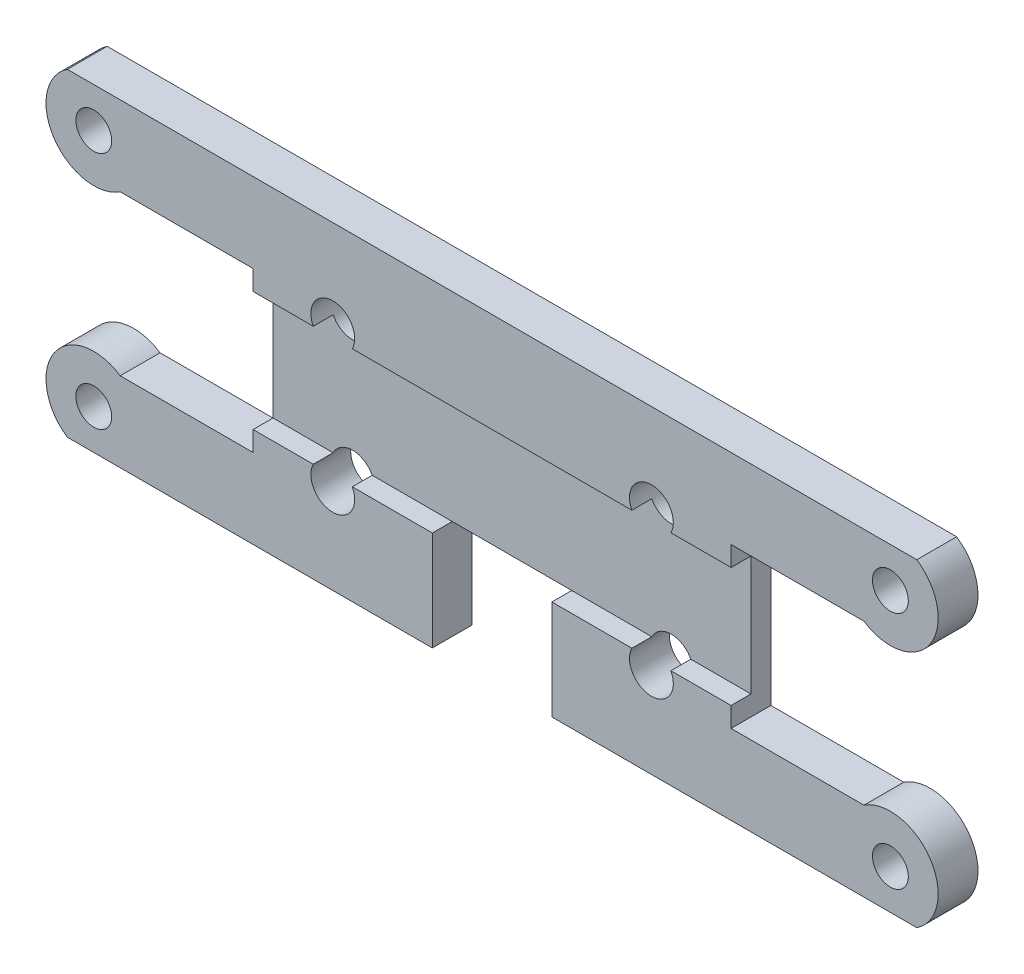
ISO-10303-21;
HEADER;
FILE_DESCRIPTION(('STEP AP214'),'2;1');
FILE_NAME('part.step','',(''),(''),'','','');
FILE_SCHEMA(('AUTOMOTIVE_DESIGN { 1 0 10303 214 1 1 1 1 }'));
ENDSEC;
DATA;
#1=APPLICATION_CONTEXT('core data for automotive mechanical design processes');
#2=APPLICATION_PROTOCOL_DEFINITION('international standard','automotive_design',2000,#1);
#3=PRODUCT_CONTEXT('',#1,'mechanical');
#4=PRODUCT('Part','Part','',(#3));
#5=PRODUCT_RELATED_PRODUCT_CATEGORY('part','',(#4));
#6=PRODUCT_DEFINITION_FORMATION('','',#4);
#7=PRODUCT_DEFINITION_CONTEXT('part definition',#1,'design');
#8=PRODUCT_DEFINITION('design','',#6,#7);
#9=PRODUCT_DEFINITION_SHAPE('','',#8);
#10=(LENGTH_UNIT() NAMED_UNIT(*) SI_UNIT(.MILLI.,.METRE.));
#11=(NAMED_UNIT(*) PLANE_ANGLE_UNIT() SI_UNIT($,.RADIAN.));
#12=(NAMED_UNIT(*) SI_UNIT($,.STERADIAN.) SOLID_ANGLE_UNIT());
#13=UNCERTAINTY_MEASURE_WITH_UNIT(LENGTH_MEASURE(1.E-05),#10,'distance_accuracy_value','');
#14=(GEOMETRIC_REPRESENTATION_CONTEXT(3) GLOBAL_UNCERTAINTY_ASSIGNED_CONTEXT((#13)) GLOBAL_UNIT_ASSIGNED_CONTEXT((#10,
#11,#12)) REPRESENTATION_CONTEXT('',''));
#15=CARTESIAN_POINT('',(0.,0.,0.));
#16=DIRECTION('',(0.,0.,1.));
#17=DIRECTION('',(1.,0.,0.));
#18=AXIS2_PLACEMENT_3D('',#15,#16,#17);
#19=CARTESIAN_POINT('',(0.,-6.,2.));
#20=DIRECTION('',(0.,0.,1.));
#21=DIRECTION('',(1.,0.,0.));
#22=AXIS2_PLACEMENT_3D('',#19,#20,#21);
#23=PLANE('',#22);
#24=DIRECTION('',(0.,1.,0.));
#25=VECTOR('',#24,1.);
#26=CARTESIAN_POINT('',(23.,-13.,2.));
#27=LINE('',#26,#25);
#28=CARTESIAN_POINT('',(23.,-7.99999999999999,2.));
#29=VERTEX_POINT('',#28);
#30=CARTESIAN_POINT('',(23.,-3.,2.));
#31=VERTEX_POINT('',#30);
#32=EDGE_CURVE('E282',#29,#31,#27,.T.);
#33=ORIENTED_EDGE('',*,*,#32,.F.);
#34=DIRECTION('',(-1.,0.,0.));
#35=VECTOR('',#34,1.);
#36=CARTESIAN_POINT('',(-1.32664991614216,-8.,2.));
#37=LINE('',#36,#35);
#38=CARTESIAN_POINT('',(41.3266499161422,-8.,2.));
#39=VERTEX_POINT('',#38);
#40=EDGE_CURVE('E457',#39,#29,#37,.T.);
#41=ORIENTED_EDGE('',*,*,#40,.F.);
#42=CARTESIAN_POINT('',(40.,-6.,2.));
#43=DIRECTION('',(0.,0.,1.));
#44=DIRECTION('',(-1.,0.,0.));
#45=AXIS2_PLACEMENT_3D('',#42,#43,#44);
#46=CIRCLE('',#45,2.4);
#47=CARTESIAN_POINT('',(38.6733500838578,-4.,2.));
#48=VERTEX_POINT('',#47);
#49=EDGE_CURVE('E318',#39,#48,#46,.T.);
#50=ORIENTED_EDGE('',*,*,#49,.T.);
#51=DIRECTION('',(-1.,0.,0.));
#52=VECTOR('',#51,1.);
#53=CARTESIAN_POINT('',(32.,-4.,2.));
#54=LINE('',#53,#52);
#55=CARTESIAN_POINT('',(32.,-4.,2.));
#56=VERTEX_POINT('',#55);
#57=EDGE_CURVE('E321',#48,#56,#54,.T.);
#58=ORIENTED_EDGE('',*,*,#57,.T.);
#59=DIRECTION('',(0.,1.,0.));
#60=VECTOR('',#59,1.);
#61=CARTESIAN_POINT('',(32.,0.,2.));
#62=LINE('',#61,#60);
#63=CARTESIAN_POINT('',(32.,-3.,2.));
#64=VERTEX_POINT('',#63);
#65=EDGE_CURVE('E324',#56,#64,#62,.T.);
#66=ORIENTED_EDGE('',*,*,#65,.T.);
#67=DIRECTION('',(1.,0.,0.));
#68=VECTOR('',#67,1.);
#69=CARTESIAN_POINT('',(32.,-3.,2.));
#70=LINE('',#69,#68);
#71=CARTESIAN_POINT('',(28.9797958971133,-3.,2.));
#72=VERTEX_POINT('',#71);
#73=EDGE_CURVE('E298',#72,#64,#70,.T.);
#74=ORIENTED_EDGE('',*,*,#73,.F.);
#75=CARTESIAN_POINT('',(28.,-3.5,2.));
#76=DIRECTION('',(0.,0.,1.));
#77=DIRECTION('',(-1.,0.,0.));
#78=AXIS2_PLACEMENT_3D('',#75,#76,#77);
#79=CIRCLE('',#78,1.1);
#80=CARTESIAN_POINT('',(27.0202041028867,-3.,2.));
#81=VERTEX_POINT('',#80);
#82=EDGE_CURVE('E306',#81,#72,#79,.T.);
#83=ORIENTED_EDGE('',*,*,#82,.F.);
#84=DIRECTION('',(-1.,0.,0.));
#85=VECTOR('',#84,1.);
#86=CARTESIAN_POINT('',(8.,-3.,2.));
#87=LINE('',#86,#85);
#88=EDGE_CURVE('E422',#81,#31,#87,.T.);
#89=ORIENTED_EDGE('',*,*,#88,.T.);
#90=EDGE_LOOP('',(#33,#41,#50,#58,#66,#74,#83,#89));
#91=FACE_BOUND('',#90,.T.);
#92=CARTESIAN_POINT('',(40.,-6.,2.));
#93=DIRECTION('',(0.,0.,1.));
#94=DIRECTION('',(-1.,0.,0.));
#95=AXIS2_PLACEMENT_3D('',#92,#93,#94);
#96=CIRCLE('',#95,0.9);
#97=CARTESIAN_POINT('',(39.1,-6.,2.));
#98=VERTEX_POINT('',#97);
#99=EDGE_CURVE('E312',#98,#98,#96,.T.);
#100=ORIENTED_EDGE('',*,*,#99,.F.);
#101=EDGE_LOOP('',(#100));
#102=FACE_BOUND('',#101,.T.);
#103=ADVANCED_FACE('F42',(#91,#102),#23,.T.);
#104=CARTESIAN_POINT('',(-1.32664991614216,-8.,2.));
#105=DIRECTION('',(0.,1.,0.));
#106=DIRECTION('',(1.,0.,0.));
#107=AXIS2_PLACEMENT_3D('',#104,#105,#106);
#108=PLANE('',#107);
#109=ORIENTED_EDGE('',*,*,#40,.T.);
#110=DIRECTION('',(0.,0.,-1.));
#111=VECTOR('',#110,1.);
#112=CARTESIAN_POINT('',(23.,-7.99999999999999,2.));
#113=LINE('',#112,#111);
#114=CARTESIAN_POINT('',(23.,-7.99999999999999,0.));
#115=VERTEX_POINT('',#114);
#116=EDGE_CURVE('E295',#29,#115,#113,.T.);
#117=ORIENTED_EDGE('',*,*,#116,.T.);
#118=DIRECTION('',(-1.,0.,0.));
#119=VECTOR('',#118,1.);
#120=CARTESIAN_POINT('',(-1.32664991614216,-8.,0.));
#121=LINE('',#120,#119);
#122=CARTESIAN_POINT('',(41.3266499161422,-8.,0.));
#123=VERTEX_POINT('',#122);
#124=EDGE_CURVE('E276',#123,#115,#121,.T.);
#125=ORIENTED_EDGE('',*,*,#124,.F.);
#126=DIRECTION('',(0.,0.,-1.));
#127=VECTOR('',#126,1.);
#128=CARTESIAN_POINT('',(41.3266499161422,-8.,2.));
#129=LINE('',#128,#127);
#130=EDGE_CURVE('E327',#39,#123,#129,.T.);
#131=ORIENTED_EDGE('',*,*,#130,.F.);
#132=EDGE_LOOP('',(#109,#117,#125,#131));
#133=FACE_BOUND('',#132,.T.);
#134=ADVANCED_FACE('F618',(#133),#108,.F.);
#135=CARTESIAN_POINT('',(8.,-3.,1.));
#136=DIRECTION('',(0.,-1.,0.));
#137=DIRECTION('',(0.,0.,1.));
#138=AXIS2_PLACEMENT_3D('',#135,#136,#137);
#139=PLANE('',#138);
#140=DIRECTION('',(-1.,0.,0.));
#141=VECTOR('',#140,1.);
#142=CARTESIAN_POINT('',(8.,-3.,1.));
#143=LINE('',#142,#141);
#144=CARTESIAN_POINT('',(27.0202041028867,-3.,1.));
#145=VERTEX_POINT('',#144);
#146=CARTESIAN_POINT('',(23.,-3.,1.));
#147=VERTEX_POINT('',#146);
#148=EDGE_CURVE('E415',#145,#147,#143,.T.);
#149=ORIENTED_EDGE('',*,*,#148,.T.);
#150=DIRECTION('',(0.,0.,1.));
#151=VECTOR('',#150,1.);
#152=CARTESIAN_POINT('',(23.,-2.99999999999999,1.));
#153=LINE('',#152,#151);
#154=EDGE_CURVE('E11',#147,#31,#153,.T.);
#155=ORIENTED_EDGE('',*,*,#154,.T.);
#156=ORIENTED_EDGE('',*,*,#88,.F.);
#157=DIRECTION('',(0.,0.,-1.));
#158=VECTOR('',#157,1.);
#159=CARTESIAN_POINT('',(27.0202041028867,-3.,2.));
#160=LINE('',#159,#158);
#161=EDGE_CURVE('E343',#81,#145,#160,.T.);
#162=ORIENTED_EDGE('',*,*,#161,.T.);
#163=EDGE_LOOP('',(#149,#155,#156,#162));
#164=FACE_BOUND('',#163,.T.);
#165=ADVANCED_FACE('F624',(#164),#139,.F.);
#166=CARTESIAN_POINT('',(0.,6.,2.));
#167=DIRECTION('',(0.,0.,1.));
#168=DIRECTION('',(1.,0.,0.));
#169=AXIS2_PLACEMENT_3D('',#166,#167,#168);
#170=PLANE('',#169);
#171=DIRECTION('',(-1.,0.,0.));
#172=VECTOR('',#171,1.);
#173=CARTESIAN_POINT('',(8.,3.,2.));
#174=LINE('',#173,#172);
#175=CARTESIAN_POINT('',(27.0202041028867,3.,2.));
#176=VERTEX_POINT('',#175);
#177=CARTESIAN_POINT('',(12.9797958971133,3.,2.));
#178=VERTEX_POINT('',#177);
#179=EDGE_CURVE('E497',#176,#178,#174,.T.);
#180=ORIENTED_EDGE('',*,*,#179,.F.);
#181=CARTESIAN_POINT('',(28.,3.5,2.));
#182=DIRECTION('',(0.,0.,-1.));
#183=DIRECTION('',(-1.,0.,0.));
#184=AXIS2_PLACEMENT_3D('',#181,#182,#183);
#185=CIRCLE('',#184,1.1);
#186=CARTESIAN_POINT('',(28.9797958971133,3.,2.));
#187=VERTEX_POINT('',#186);
#188=EDGE_CURVE('E361',#176,#187,#185,.T.);
#189=ORIENTED_EDGE('',*,*,#188,.T.);
#190=DIRECTION('',(1.,0.,0.));
#191=VECTOR('',#190,1.);
#192=CARTESIAN_POINT('',(32.,3.,2.));
#193=LINE('',#192,#191);
#194=CARTESIAN_POINT('',(32.,3.,2.));
#195=VERTEX_POINT('',#194);
#196=EDGE_CURVE('E346',#187,#195,#193,.T.);
#197=ORIENTED_EDGE('',*,*,#196,.T.);
#198=DIRECTION('',(0.,-1.,0.));
#199=VECTOR('',#198,1.);
#200=CARTESIAN_POINT('',(32.,0.,2.));
#201=LINE('',#200,#199);
#202=CARTESIAN_POINT('',(32.,4.,2.));
#203=VERTEX_POINT('',#202);
#204=EDGE_CURVE('E383',#203,#195,#201,.T.);
#205=ORIENTED_EDGE('',*,*,#204,.F.);
#206=DIRECTION('',(-1.,0.,0.));
#207=VECTOR('',#206,1.);
#208=CARTESIAN_POINT('',(32.,4.,2.));
#209=LINE('',#208,#207);
#210=CARTESIAN_POINT('',(38.6733500838578,4.,2.));
#211=VERTEX_POINT('',#210);
#212=EDGE_CURVE('E378',#211,#203,#209,.T.);
#213=ORIENTED_EDGE('',*,*,#212,.F.);
#214=CARTESIAN_POINT('',(40.,6.,2.));
#215=DIRECTION('',(0.,0.,-1.));
#216=DIRECTION('',(-1.,0.,0.));
#217=AXIS2_PLACEMENT_3D('',#214,#215,#216);
#218=CIRCLE('',#217,2.4);
#219=CARTESIAN_POINT('',(41.3266499161422,8.,2.));
#220=VERTEX_POINT('',#219);
#221=EDGE_CURVE('E374',#220,#211,#218,.T.);
#222=ORIENTED_EDGE('',*,*,#221,.F.);
#223=DIRECTION('',(-1.,0.,0.));
#224=VECTOR('',#223,1.);
#225=CARTESIAN_POINT('',(-1.32664991614216,8.,2.));
#226=LINE('',#225,#224);
#227=CARTESIAN_POINT('',(-1.32664991614216,8.,2.));
#228=VERTEX_POINT('',#227);
#229=EDGE_CURVE('E525',#220,#228,#226,.T.);
#230=ORIENTED_EDGE('',*,*,#229,.T.);
#231=CARTESIAN_POINT('',(0.,6.,2.));
#232=DIRECTION('',(0.,0.,1.));
#233=DIRECTION('',(1.,0.,0.));
#234=AXIS2_PLACEMENT_3D('',#231,#232,#233);
#235=CIRCLE('',#234,2.4);
#236=CARTESIAN_POINT('',(1.32664991614216,4.,2.));
#237=VERTEX_POINT('',#236);
#238=EDGE_CURVE('E516',#228,#237,#235,.T.);
#239=ORIENTED_EDGE('',*,*,#238,.T.);
#240=DIRECTION('',(1.,0.,0.));
#241=VECTOR('',#240,1.);
#242=CARTESIAN_POINT('',(8.,4.,2.));
#243=LINE('',#242,#241);
#244=CARTESIAN_POINT('',(8.,4.,2.));
#245=VERTEX_POINT('',#244);
#246=EDGE_CURVE('E519',#237,#245,#243,.T.);
#247=ORIENTED_EDGE('',*,*,#246,.T.);
#248=DIRECTION('',(0.,-1.,0.));
#249=VECTOR('',#248,1.);
#250=CARTESIAN_POINT('',(8.,0.,2.));
#251=LINE('',#250,#249);
#252=CARTESIAN_POINT('',(8.,3.,2.));
#253=VERTEX_POINT('',#252);
#254=EDGE_CURVE('E522',#245,#253,#251,.T.);
#255=ORIENTED_EDGE('',*,*,#254,.T.);
#256=CARTESIAN_POINT('',(11.0202041028867,3.,2.));
#257=VERTEX_POINT('',#256);
#258=EDGE_CURVE('E492',#257,#253,#174,.T.);
#259=ORIENTED_EDGE('',*,*,#258,.F.);
#260=CARTESIAN_POINT('',(12.,3.5,2.));
#261=DIRECTION('',(0.,0.,1.));
#262=DIRECTION('',(1.,0.,0.));
#263=AXIS2_PLACEMENT_3D('',#260,#261,#262);
#264=CIRCLE('',#263,1.1);
#265=EDGE_CURVE('E504',#178,#257,#264,.T.);
#266=ORIENTED_EDGE('',*,*,#265,.F.);
#267=EDGE_LOOP('',(#180,#189,#197,#205,#213,#222,#230,#239,#247,#255,#259,#266));
#268=FACE_BOUND('',#267,.T.);
#269=CARTESIAN_POINT('',(0.,6.,2.));
#270=DIRECTION('',(0.,0.,1.));
#271=DIRECTION('',(1.,0.,0.));
#272=AXIS2_PLACEMENT_3D('',#269,#270,#271);
#273=CIRCLE('',#272,0.9);
#274=CARTESIAN_POINT('',(0.9,6.,2.));
#275=VERTEX_POINT('',#274);
#276=EDGE_CURVE('E510',#275,#275,#273,.T.);
#277=ORIENTED_EDGE('',*,*,#276,.F.);
#278=EDGE_LOOP('',(#277));
#279=FACE_BOUND('',#278,.T.);
#280=CARTESIAN_POINT('',(40.,6.,2.));
#281=DIRECTION('',(0.,0.,-1.));
#282=DIRECTION('',(-1.,0.,0.));
#283=AXIS2_PLACEMENT_3D('',#280,#281,#282);
#284=CIRCLE('',#283,0.9);
#285=CARTESIAN_POINT('',(39.1,6.,2.));
#286=VERTEX_POINT('',#285);
#287=EDGE_CURVE('E367',#286,#286,#284,.T.);
#288=ORIENTED_EDGE('',*,*,#287,.T.);
#289=EDGE_LOOP('',(#288));
#290=FACE_BOUND('',#289,.T.);
#291=ADVANCED_FACE('F591',(#268,#279,#290),#170,.T.);
#292=CARTESIAN_POINT('',(0.,6.,0.));
#293=DIRECTION('',(0.,0.,1.));
#294=DIRECTION('',(1.,0.,0.));
#295=AXIS2_PLACEMENT_3D('',#292,#293,#294);
#296=PLANE('',#295);
#297=ORIENTED_EDGE('',*,*,#124,.T.);
#298=DIRECTION('',(0.,1.,0.));
#299=VECTOR('',#298,1.);
#300=CARTESIAN_POINT('',(23.,-13.,0.));
#301=LINE('',#300,#299);
#302=CARTESIAN_POINT('',(23.,-3.,0.));
#303=VERTEX_POINT('',#302);
#304=EDGE_CURVE('E258',#115,#303,#301,.T.);
#305=ORIENTED_EDGE('',*,*,#304,.T.);
#306=DIRECTION('',(-1.,0.,0.));
#307=VECTOR('',#306,1.);
#308=CARTESIAN_POINT('',(17.,-3.,0.));
#309=LINE('',#308,#307);
#310=CARTESIAN_POINT('',(17.,-3.,0.));
#311=VERTEX_POINT('',#310);
#312=EDGE_CURVE('E266',#303,#311,#309,.T.);
#313=ORIENTED_EDGE('',*,*,#312,.T.);
#314=DIRECTION('',(0.,-1.,0.));
#315=VECTOR('',#314,1.);
#316=CARTESIAN_POINT('',(17.,-13.,0.));
#317=LINE('',#316,#315);
#318=CARTESIAN_POINT('',(17.,-7.99999999999999,0.));
#319=VERTEX_POINT('',#318);
#320=EDGE_CURVE('E263',#311,#319,#317,.T.);
#321=ORIENTED_EDGE('',*,*,#320,.T.);
#322=CARTESIAN_POINT('',(-1.32664991614216,-8.,0.));
#323=VERTEX_POINT('',#322);
#324=EDGE_CURVE('E469',#319,#323,#121,.T.);
#325=ORIENTED_EDGE('',*,*,#324,.T.);
#326=CARTESIAN_POINT('',(0.,-6.,0.));
#327=DIRECTION('',(0.,0.,-1.));
#328=DIRECTION('',(1.,0.,0.));
#329=AXIS2_PLACEMENT_3D('',#326,#327,#328);
#330=CIRCLE('',#329,2.4);
#331=CARTESIAN_POINT('',(1.32664991614216,-4.,0.));
#332=VERTEX_POINT('',#331);
#333=EDGE_CURVE('E441',#323,#332,#330,.T.);
#334=ORIENTED_EDGE('',*,*,#333,.T.);
#335=DIRECTION('',(1.,0.,0.));
#336=VECTOR('',#335,1.);
#337=CARTESIAN_POINT('',(8.,-4.,0.));
#338=LINE('',#337,#336);
#339=CARTESIAN_POINT('',(8.,-4.,0.));
#340=VERTEX_POINT('',#339);
#341=EDGE_CURVE('E465',#332,#340,#338,.T.);
#342=ORIENTED_EDGE('',*,*,#341,.T.);
#343=DIRECTION('',(0.,-1.,0.));
#344=VECTOR('',#343,1.);
#345=CARTESIAN_POINT('',(8.,0.,0.));
#346=LINE('',#345,#344);
#347=CARTESIAN_POINT('',(8.,4.,0.));
#348=VERTEX_POINT('',#347);
#349=EDGE_CURVE('E532',#348,#340,#346,.T.);
#350=ORIENTED_EDGE('',*,*,#349,.F.);
#351=DIRECTION('',(1.,0.,0.));
#352=VECTOR('',#351,1.);
#353=CARTESIAN_POINT('',(8.,4.,0.));
#354=LINE('',#353,#352);
#355=CARTESIAN_POINT('',(1.32664991614216,4.,0.));
#356=VERTEX_POINT('',#355);
#357=EDGE_CURVE('E530',#356,#348,#354,.T.);
#358=ORIENTED_EDGE('',*,*,#357,.F.);
#359=CARTESIAN_POINT('',(0.,6.,0.));
#360=DIRECTION('',(0.,0.,1.));
#361=DIRECTION('',(1.,0.,0.));
#362=AXIS2_PLACEMENT_3D('',#359,#360,#361);
#363=CIRCLE('',#362,2.4);
#364=CARTESIAN_POINT('',(-1.32664991614216,8.,0.));
#365=VERTEX_POINT('',#364);
#366=EDGE_CURVE('E513',#365,#356,#363,.T.);
#367=ORIENTED_EDGE('',*,*,#366,.F.);
#368=DIRECTION('',(-1.,0.,0.));
#369=VECTOR('',#368,1.);
#370=CARTESIAN_POINT('',(-1.32664991614216,8.,0.));
#371=LINE('',#370,#369);
#372=CARTESIAN_POINT('',(41.3266499161422,8.,0.));
#373=VERTEX_POINT('',#372);
#374=EDGE_CURVE('E520',#373,#365,#371,.T.);
#375=ORIENTED_EDGE('',*,*,#374,.F.);
#376=CARTESIAN_POINT('',(40.,6.,0.));
#377=DIRECTION('',(0.,0.,-1.));
#378=DIRECTION('',(-1.,0.,0.));
#379=AXIS2_PLACEMENT_3D('',#376,#377,#378);
#380=CIRCLE('',#379,2.4);
#381=CARTESIAN_POINT('',(38.6733500838578,4.,0.));
#382=VERTEX_POINT('',#381);
#383=EDGE_CURVE('E371',#373,#382,#380,.T.);
#384=ORIENTED_EDGE('',*,*,#383,.T.);
#385=DIRECTION('',(-1.,0.,0.));
#386=VECTOR('',#385,1.);
#387=CARTESIAN_POINT('',(32.,4.,0.));
#388=LINE('',#387,#386);
#389=CARTESIAN_POINT('',(32.,4.,0.));
#390=VERTEX_POINT('',#389);
#391=EDGE_CURVE('E391',#382,#390,#388,.T.);
#392=ORIENTED_EDGE('',*,*,#391,.T.);
#393=DIRECTION('',(0.,-1.,0.));
#394=VECTOR('',#393,1.);
#395=CARTESIAN_POINT('',(32.,0.,0.));
#396=LINE('',#395,#394);
#397=CARTESIAN_POINT('',(32.,-4.,0.));
#398=VERTEX_POINT('',#397);
#399=EDGE_CURVE('E379',#390,#398,#396,.T.);
#400=ORIENTED_EDGE('',*,*,#399,.T.);
#401=DIRECTION('',(-1.,0.,0.));
#402=VECTOR('',#401,1.);
#403=CARTESIAN_POINT('',(32.,-4.,0.));
#404=LINE('',#403,#402);
#405=CARTESIAN_POINT('',(38.6733500838578,-4.,0.));
#406=VERTEX_POINT('',#405);
#407=EDGE_CURVE('E322',#406,#398,#404,.T.);
#408=ORIENTED_EDGE('',*,*,#407,.F.);
#409=CARTESIAN_POINT('',(40.,-6.,0.));
#410=DIRECTION('',(0.,0.,1.));
#411=DIRECTION('',(-1.,0.,0.));
#412=AXIS2_PLACEMENT_3D('',#409,#410,#411);
#413=CIRCLE('',#412,2.4);
#414=EDGE_CURVE('E315',#123,#406,#413,.T.);
#415=ORIENTED_EDGE('',*,*,#414,.F.);
#416=EDGE_LOOP('',(#297,#305,#313,#321,#325,#334,#342,#350,#358,#367,#375,#384,#392,#400,#408,#415));
#417=FACE_BOUND('',#416,.T.);
#418=CARTESIAN_POINT('',(0.,6.,0.));
#419=DIRECTION('',(0.,0.,1.));
#420=DIRECTION('',(1.,0.,0.));
#421=AXIS2_PLACEMENT_3D('',#418,#419,#420);
#422=CIRCLE('',#421,0.9);
#423=CARTESIAN_POINT('',(0.9,6.,0.));
#424=VERTEX_POINT('',#423);
#425=EDGE_CURVE('E507',#424,#424,#422,.T.);
#426=ORIENTED_EDGE('',*,*,#425,.T.);
#427=EDGE_LOOP('',(#426));
#428=FACE_BOUND('',#427,.T.);
#429=CARTESIAN_POINT('',(12.,3.5,0.));
#430=DIRECTION('',(0.,0.,1.));
#431=DIRECTION('',(1.,0.,0.));
#432=AXIS2_PLACEMENT_3D('',#429,#430,#431);
#433=CIRCLE('',#432,1.1);
#434=CARTESIAN_POINT('',(13.1,3.5,0.));
#435=VERTEX_POINT('',#434);
#436=EDGE_CURVE('E503',#435,#435,#433,.T.);
#437=ORIENTED_EDGE('',*,*,#436,.T.);
#438=EDGE_LOOP('',(#437));
#439=FACE_BOUND('',#438,.T.);
#440=CARTESIAN_POINT('',(0.,-6.,0.));
#441=DIRECTION('',(0.,0.,-1.));
#442=DIRECTION('',(1.,0.,0.));
#443=AXIS2_PLACEMENT_3D('',#440,#441,#442);
#444=CIRCLE('',#443,0.9);
#445=CARTESIAN_POINT('',(0.900000000000001,-6.,0.));
#446=VERTEX_POINT('',#445);
#447=EDGE_CURVE('E433',#446,#446,#444,.T.);
#448=ORIENTED_EDGE('',*,*,#447,.F.);
#449=EDGE_LOOP('',(#448));
#450=FACE_BOUND('',#449,.T.);
#451=CARTESIAN_POINT('',(12.,-3.5,0.));
#452=DIRECTION('',(0.,0.,-1.));
#453=DIRECTION('',(1.,0.,0.));
#454=AXIS2_PLACEMENT_3D('',#451,#452,#453);
#455=CIRCLE('',#454,1.1);
#456=CARTESIAN_POINT('',(13.1,-3.5,0.));
#457=VERTEX_POINT('',#456);
#458=EDGE_CURVE('E428',#457,#457,#455,.T.);
#459=ORIENTED_EDGE('',*,*,#458,.F.);
#460=EDGE_LOOP('',(#459));
#461=FACE_BOUND('',#460,.T.);
#462=CARTESIAN_POINT('',(40.,6.,0.));
#463=DIRECTION('',(0.,0.,-1.));
#464=DIRECTION('',(-1.,0.,0.));
#465=AXIS2_PLACEMENT_3D('',#462,#463,#464);
#466=CIRCLE('',#465,0.9);
#467=CARTESIAN_POINT('',(39.1,6.,0.));
#468=VERTEX_POINT('',#467);
#469=EDGE_CURVE('E364',#468,#468,#466,.T.);
#470=ORIENTED_EDGE('',*,*,#469,.F.);
#471=EDGE_LOOP('',(#470));
#472=FACE_BOUND('',#471,.T.);
#473=CARTESIAN_POINT('',(28.,3.5,0.));
#474=DIRECTION('',(0.,0.,-1.));
#475=DIRECTION('',(-1.,0.,0.));
#476=AXIS2_PLACEMENT_3D('',#473,#474,#475);
#477=CIRCLE('',#476,1.1);
#478=CARTESIAN_POINT('',(26.9,3.5,0.));
#479=VERTEX_POINT('',#478);
#480=EDGE_CURVE('E360',#479,#479,#477,.T.);
#481=ORIENTED_EDGE('',*,*,#480,.F.);
#482=EDGE_LOOP('',(#481));
#483=FACE_BOUND('',#482,.T.);
#484=CARTESIAN_POINT('',(40.,-6.,0.));
#485=DIRECTION('',(0.,0.,1.));
#486=DIRECTION('',(-1.,0.,0.));
#487=AXIS2_PLACEMENT_3D('',#484,#485,#486);
#488=CIRCLE('',#487,0.9);
#489=CARTESIAN_POINT('',(39.1,-6.,0.));
#490=VERTEX_POINT('',#489);
#491=EDGE_CURVE('E309',#490,#490,#488,.T.);
#492=ORIENTED_EDGE('',*,*,#491,.T.);
#493=EDGE_LOOP('',(#492));
#494=FACE_BOUND('',#493,.T.);
#495=CARTESIAN_POINT('',(28.,-3.5,0.));
#496=DIRECTION('',(0.,0.,1.));
#497=DIRECTION('',(-1.,0.,0.));
#498=AXIS2_PLACEMENT_3D('',#495,#496,#497);
#499=CIRCLE('',#498,1.1);
#500=CARTESIAN_POINT('',(26.9,-3.5,0.));
#501=VERTEX_POINT('',#500);
#502=EDGE_CURVE('E305',#501,#501,#499,.T.);
#503=ORIENTED_EDGE('',*,*,#502,.T.);
#504=EDGE_LOOP('',(#503));
#505=FACE_BOUND('',#504,.T.);
#506=ADVANCED_FACE('F273',(#417,#428,#439,#450,#461,#472,#483,#494,#505),#296,.F.);
#507=CARTESIAN_POINT('',(0.,6.,2.));
#508=DIRECTION('',(0.,0.,-1.));
#509=DIRECTION('',(-1.,0.,0.));
#510=AXIS2_PLACEMENT_3D('',#507,#508,#509);
#511=CYLINDRICAL_SURFACE('',#510,2.4);
#512=ORIENTED_EDGE('',*,*,#366,.T.);
#513=DIRECTION('',(0.,0.,-1.));
#514=VECTOR('',#513,1.);
#515=CARTESIAN_POINT('',(1.32664991614216,4.,2.));
#516=LINE('',#515,#514);
#517=EDGE_CURVE('E541',#237,#356,#516,.T.);
#518=ORIENTED_EDGE('',*,*,#517,.F.);
#519=ORIENTED_EDGE('',*,*,#238,.F.);
#520=DIRECTION('',(0.,0.,-1.));
#521=VECTOR('',#520,1.);
#522=CARTESIAN_POINT('',(-1.32664991614216,8.,2.));
#523=LINE('',#522,#521);
#524=EDGE_CURVE('E527',#228,#365,#523,.T.);
#525=ORIENTED_EDGE('',*,*,#524,.T.);
#526=EDGE_LOOP('',(#512,#518,#519,#525));
#527=FACE_BOUND('',#526,.T.);
#528=ADVANCED_FACE('F44',(#527),#511,.T.);
#529=CARTESIAN_POINT('',(8.,4.,2.));
#530=DIRECTION('',(0.,1.,0.));
#531=DIRECTION('',(0.,0.,1.));
#532=AXIS2_PLACEMENT_3D('',#529,#530,#531);
#533=PLANE('',#532);
#534=ORIENTED_EDGE('',*,*,#357,.T.);
#535=DIRECTION('',(0.,0.,-1.));
#536=VECTOR('',#535,1.);
#537=CARTESIAN_POINT('',(8.,4.,2.));
#538=LINE('',#537,#536);
#539=EDGE_CURVE('E538',#245,#348,#538,.T.);
#540=ORIENTED_EDGE('',*,*,#539,.F.);
#541=ORIENTED_EDGE('',*,*,#246,.F.);
#542=ORIENTED_EDGE('',*,*,#517,.T.);
#543=EDGE_LOOP('',(#534,#540,#541,#542));
#544=FACE_BOUND('',#543,.T.);
#545=ADVANCED_FACE('F666',(#544),#533,.F.);
#546=CARTESIAN_POINT('',(8.,0.,2.));
#547=DIRECTION('',(1.,0.,0.));
#548=DIRECTION('',(0.,0.,-1.));
#549=AXIS2_PLACEMENT_3D('',#546,#547,#548);
#550=PLANE('',#549);
#551=DIRECTION('',(0.,-1.,0.));
#552=VECTOR('',#551,1.);
#553=CARTESIAN_POINT('',(8.,0.,1.));
#554=LINE('',#553,#552);
#555=CARTESIAN_POINT('',(8.,3.,1.));
#556=VERTEX_POINT('',#555);
#557=CARTESIAN_POINT('',(8.,-3.,1.));
#558=VERTEX_POINT('',#557);
#559=EDGE_CURVE('E493',#556,#558,#554,.T.);
#560=ORIENTED_EDGE('',*,*,#559,.F.);
#561=DIRECTION('',(0.,0.,1.));
#562=VECTOR('',#561,1.);
#563=CARTESIAN_POINT('',(8.,3.,1.));
#564=LINE('',#563,#562);
#565=EDGE_CURVE('E499',#556,#253,#564,.T.);
#566=ORIENTED_EDGE('',*,*,#565,.T.);
#567=ORIENTED_EDGE('',*,*,#254,.F.);
#568=ORIENTED_EDGE('',*,*,#539,.T.);
#569=ORIENTED_EDGE('',*,*,#349,.T.);
#570=DIRECTION('',(0.,0.,-1.));
#571=VECTOR('',#570,1.);
#572=CARTESIAN_POINT('',(8.,-4.,2.));
#573=LINE('',#572,#571);
#574=CARTESIAN_POINT('',(8.,-4.,2.));
#575=VERTEX_POINT('',#574);
#576=EDGE_CURVE('E474',#575,#340,#573,.T.);
#577=ORIENTED_EDGE('',*,*,#576,.F.);
#578=DIRECTION('',(0.,1.,0.));
#579=VECTOR('',#578,1.);
#580=CARTESIAN_POINT('',(8.,0.,2.));
#581=LINE('',#580,#579);
#582=CARTESIAN_POINT('',(8.,-3.,2.));
#583=VERTEX_POINT('',#582);
#584=EDGE_CURVE('E453',#575,#583,#581,.T.);
#585=ORIENTED_EDGE('',*,*,#584,.T.);
#586=DIRECTION('',(0.,0.,1.));
#587=VECTOR('',#586,1.);
#588=CARTESIAN_POINT('',(8.,-3.,1.));
#589=LINE('',#588,#587);
#590=EDGE_CURVE('E418',#558,#583,#589,.T.);
#591=ORIENTED_EDGE('',*,*,#590,.F.);
#592=EDGE_LOOP('',(#560,#566,#567,#568,#569,#577,#585,#591));
#593=FACE_BOUND('',#592,.T.);
#594=ADVANCED_FACE('F571',(#593),#550,.F.);
#595=CARTESIAN_POINT('',(-1.32664991614216,8.,2.));
#596=DIRECTION('',(0.,-1.,0.));
#597=DIRECTION('',(1.,0.,0.));
#598=AXIS2_PLACEMENT_3D('',#595,#596,#597);
#599=PLANE('',#598);
#600=ORIENTED_EDGE('',*,*,#374,.T.);
#601=ORIENTED_EDGE('',*,*,#524,.F.);
#602=ORIENTED_EDGE('',*,*,#229,.F.);
#603=DIRECTION('',(0.,0.,-1.));
#604=VECTOR('',#603,1.);
#605=CARTESIAN_POINT('',(41.3266499161422,8.,2.));
#606=LINE('',#605,#604);
#607=EDGE_CURVE('E387',#220,#373,#606,.T.);
#608=ORIENTED_EDGE('',*,*,#607,.T.);
#609=EDGE_LOOP('',(#600,#601,#602,#608));
#610=FACE_BOUND('',#609,.T.);
#611=ADVANCED_FACE('F657',(#610),#599,.F.);
#612=CARTESIAN_POINT('',(0.,6.,2.));
#613=DIRECTION('',(0.,0.,-1.));
#614=DIRECTION('',(-1.,0.,0.));
#615=AXIS2_PLACEMENT_3D('',#612,#613,#614);
#616=CYLINDRICAL_SURFACE('',#615,0.9);
#617=ORIENTED_EDGE('',*,*,#276,.T.);
#618=EDGE_LOOP('',(#617));
#619=FACE_BOUND('',#618,.T.);
#620=ORIENTED_EDGE('',*,*,#425,.F.);
#621=EDGE_LOOP('',(#620));
#622=FACE_BOUND('',#621,.T.);
#623=ADVANCED_FACE('F653',(#619,#622),#616,.F.);
#624=CARTESIAN_POINT('',(12.,3.5,2.));
#625=DIRECTION('',(0.,0.,-1.));
#626=DIRECTION('',(-1.,0.,0.));
#627=AXIS2_PLACEMENT_3D('',#624,#625,#626);
#628=CYLINDRICAL_SURFACE('',#627,1.1);
#629=DIRECTION('',(0.,0.,-1.));
#630=VECTOR('',#629,1.);
#631=CARTESIAN_POINT('',(12.9797958971133,3.,2.));
#632=LINE('',#631,#630);
#633=CARTESIAN_POINT('',(12.9797958971133,3.,1.));
#634=VERTEX_POINT('',#633);
#635=EDGE_CURVE('E548',#178,#634,#632,.T.);
#636=ORIENTED_EDGE('',*,*,#635,.F.);
#637=ORIENTED_EDGE('',*,*,#265,.T.);
#638=DIRECTION('',(0.,0.,-1.));
#639=VECTOR('',#638,1.);
#640=CARTESIAN_POINT('',(11.0202041028867,3.,2.));
#641=LINE('',#640,#639);
#642=CARTESIAN_POINT('',(11.0202041028867,3.,1.));
#643=VERTEX_POINT('',#642);
#644=EDGE_CURVE('E546',#643,#257,#641,.F.);
#645=ORIENTED_EDGE('',*,*,#644,.F.);
#646=CARTESIAN_POINT('',(12.,3.5,1.));
#647=DIRECTION('',(0.,0.,-1.));
#648=DIRECTION('',(-1.,0.,0.));
#649=AXIS2_PLACEMENT_3D('',#646,#647,#648);
#650=CIRCLE('',#649,1.1);
#651=EDGE_CURVE('E544',#634,#643,#650,.T.);
#652=ORIENTED_EDGE('',*,*,#651,.F.);
#653=EDGE_LOOP('',(#636,#637,#645,#652));
#654=FACE_BOUND('',#653,.T.);
#655=ORIENTED_EDGE('',*,*,#436,.F.);
#656=EDGE_LOOP('',(#655));
#657=FACE_BOUND('',#656,.T.);
#658=ADVANCED_FACE('F650',(#654,#657),#628,.F.);
#659=CARTESIAN_POINT('',(8.,3.,1.));
#660=DIRECTION('',(0.,1.,0.));
#661=DIRECTION('',(0.,0.,1.));
#662=AXIS2_PLACEMENT_3D('',#659,#660,#661);
#663=PLANE('',#662);
#664=ORIENTED_EDGE('',*,*,#635,.T.);
#665=DIRECTION('',(-1.,0.,0.));
#666=VECTOR('',#665,1.);
#667=CARTESIAN_POINT('',(8.,3.,1.));
#668=LINE('',#667,#666);
#669=CARTESIAN_POINT('',(27.0202041028867,3.,1.));
#670=VERTEX_POINT('',#669);
#671=EDGE_CURVE('E68',#670,#634,#668,.T.);
#672=ORIENTED_EDGE('',*,*,#671,.F.);
#673=DIRECTION('',(0.,0.,-1.));
#674=VECTOR('',#673,1.);
#675=CARTESIAN_POINT('',(27.0202041028867,3.,2.));
#676=LINE('',#675,#674);
#677=EDGE_CURVE('E411',#176,#670,#676,.T.);
#678=ORIENTED_EDGE('',*,*,#677,.F.);
#679=ORIENTED_EDGE('',*,*,#179,.T.);
#680=EDGE_LOOP('',(#664,#672,#678,#679));
#681=FACE_BOUND('',#680,.T.);
#682=ADVANCED_FACE('F645',(#681),#663,.F.);
#683=ORIENTED_EDGE('',*,*,#644,.T.);
#684=ORIENTED_EDGE('',*,*,#258,.T.);
#685=ORIENTED_EDGE('',*,*,#565,.F.);
#686=EDGE_CURVE('E496',#643,#556,#668,.T.);
#687=ORIENTED_EDGE('',*,*,#686,.F.);
#688=EDGE_LOOP('',(#683,#684,#685,#687));
#689=FACE_BOUND('',#688,.T.);
#690=ADVANCED_FACE('F640',(#689),#663,.F.);
#691=CARTESIAN_POINT('',(0.,0.,1.));
#692=DIRECTION('',(0.,0.,-1.));
#693=DIRECTION('',(-1.,0.,0.));
#694=AXIS2_PLACEMENT_3D('',#691,#692,#693);
#695=PLANE('',#694);
#696=ORIENTED_EDGE('',*,*,#651,.T.);
#697=ORIENTED_EDGE('',*,*,#686,.T.);
#698=ORIENTED_EDGE('',*,*,#559,.T.);
#699=CARTESIAN_POINT('',(11.0202041028867,-3.,1.));
#700=VERTEX_POINT('',#699);
#701=EDGE_CURVE('E421',#700,#558,#143,.T.);
#702=ORIENTED_EDGE('',*,*,#701,.F.);
#703=CARTESIAN_POINT('',(12.,-3.5,1.));
#704=DIRECTION('',(0.,0.,1.));
#705=DIRECTION('',(-1.,0.,0.));
#706=AXIS2_PLACEMENT_3D('',#703,#704,#705);
#707=CIRCLE('',#706,1.1);
#708=CARTESIAN_POINT('',(12.9797958971133,-3.,1.));
#709=VERTEX_POINT('',#708);
#710=EDGE_CURVE('E481',#709,#700,#707,.T.);
#711=ORIENTED_EDGE('',*,*,#710,.F.);
#712=CARTESIAN_POINT('',(17.,-3.,1.));
#713=VERTEX_POINT('',#712);
#714=EDGE_CURVE('E420',#713,#709,#143,.T.);
#715=ORIENTED_EDGE('',*,*,#714,.F.);
#716=EDGE_CURVE('E419',#147,#713,#143,.T.);
#717=ORIENTED_EDGE('',*,*,#716,.F.);
#718=ORIENTED_EDGE('',*,*,#148,.F.);
#719=CARTESIAN_POINT('',(28.,-3.5,1.));
#720=DIRECTION('',(0.,0.,-1.));
#721=DIRECTION('',(1.,0.,0.));
#722=AXIS2_PLACEMENT_3D('',#719,#720,#721);
#723=CIRCLE('',#722,1.1);
#724=CARTESIAN_POINT('',(28.9797958971133,-3.,1.));
#725=VERTEX_POINT('',#724);
#726=EDGE_CURVE('E338',#145,#725,#723,.T.);
#727=ORIENTED_EDGE('',*,*,#726,.T.);
#728=DIRECTION('',(1.,0.,0.));
#729=VECTOR('',#728,1.);
#730=CARTESIAN_POINT('',(32.,-3.,1.));
#731=LINE('',#730,#729);
#732=CARTESIAN_POINT('',(32.,-3.,1.));
#733=VERTEX_POINT('',#732);
#734=EDGE_CURVE('E299',#725,#733,#731,.T.);
#735=ORIENTED_EDGE('',*,*,#734,.T.);
#736=DIRECTION('',(0.,-1.,0.));
#737=VECTOR('',#736,1.);
#738=CARTESIAN_POINT('',(32.,0.,1.));
#739=LINE('',#738,#737);
#740=CARTESIAN_POINT('',(32.,3.,1.));
#741=VERTEX_POINT('',#740);
#742=EDGE_CURVE('E347',#741,#733,#739,.T.);
#743=ORIENTED_EDGE('',*,*,#742,.F.);
#744=DIRECTION('',(1.,0.,0.));
#745=VECTOR('',#744,1.);
#746=CARTESIAN_POINT('',(32.,3.,1.));
#747=LINE('',#746,#745);
#748=CARTESIAN_POINT('',(28.9797958971133,3.,1.));
#749=VERTEX_POINT('',#748);
#750=EDGE_CURVE('E351',#749,#741,#747,.T.);
#751=ORIENTED_EDGE('',*,*,#750,.F.);
#752=CARTESIAN_POINT('',(28.,3.5,1.));
#753=DIRECTION('',(0.,0.,1.));
#754=DIRECTION('',(1.,0.,0.));
#755=AXIS2_PLACEMENT_3D('',#752,#753,#754);
#756=CIRCLE('',#755,1.1);
#757=EDGE_CURVE('E406',#670,#749,#756,.T.);
#758=ORIENTED_EDGE('',*,*,#757,.F.);
#759=ORIENTED_EDGE('',*,*,#671,.T.);
#760=EDGE_LOOP('',(#696,#697,#698,#702,#711,#715,#717,#718,#727,#735,#743,#751,#758,#759));
#761=FACE_BOUND('',#760,.T.);
#762=ADVANCED_FACE('F559',(#761),#695,.F.);
#763=DIRECTION('',(0.,-1.,0.));
#764=VECTOR('',#763,1.);
#765=CARTESIAN_POINT('',(17.,-13.,2.));
#766=LINE('',#765,#764);
#767=CARTESIAN_POINT('',(17.,-3.,2.));
#768=VERTEX_POINT('',#767);
#769=CARTESIAN_POINT('',(17.,-7.99999999999999,2.));
#770=VERTEX_POINT('',#769);
#771=EDGE_CURVE('E278',#768,#770,#766,.T.);
#772=ORIENTED_EDGE('',*,*,#771,.F.);
#773=CARTESIAN_POINT('',(12.9797958971133,-3.,2.));
#774=VERTEX_POINT('',#773);
#775=EDGE_CURVE('E425',#768,#774,#87,.T.);
#776=ORIENTED_EDGE('',*,*,#775,.T.);
#777=CARTESIAN_POINT('',(12.,-3.5,2.));
#778=DIRECTION('',(0.,0.,-1.));
#779=DIRECTION('',(1.,0.,0.));
#780=AXIS2_PLACEMENT_3D('',#777,#778,#779);
#781=CIRCLE('',#780,1.1);
#782=CARTESIAN_POINT('',(11.0202041028867,-3.,2.));
#783=VERTEX_POINT('',#782);
#784=EDGE_CURVE('E429',#774,#783,#781,.T.);
#785=ORIENTED_EDGE('',*,*,#784,.T.);
#786=EDGE_CURVE('E414',#783,#583,#87,.T.);
#787=ORIENTED_EDGE('',*,*,#786,.T.);
#788=ORIENTED_EDGE('',*,*,#584,.F.);
#789=DIRECTION('',(1.,0.,0.));
#790=VECTOR('',#789,1.);
#791=CARTESIAN_POINT('',(8.,-4.,2.));
#792=LINE('',#791,#790);
#793=CARTESIAN_POINT('',(1.32664991614216,-4.,2.));
#794=VERTEX_POINT('',#793);
#795=EDGE_CURVE('E449',#794,#575,#792,.T.);
#796=ORIENTED_EDGE('',*,*,#795,.F.);
#797=CARTESIAN_POINT('',(0.,-6.,2.));
#798=DIRECTION('',(0.,0.,-1.));
#799=DIRECTION('',(1.,0.,0.));
#800=AXIS2_PLACEMENT_3D('',#797,#798,#799);
#801=CIRCLE('',#800,2.4);
#802=CARTESIAN_POINT('',(-1.32664991614216,-8.,2.));
#803=VERTEX_POINT('',#802);
#804=EDGE_CURVE('E445',#803,#794,#801,.T.);
#805=ORIENTED_EDGE('',*,*,#804,.F.);
#806=EDGE_CURVE('E456',#770,#803,#37,.T.);
#807=ORIENTED_EDGE('',*,*,#806,.F.);
#808=EDGE_LOOP('',(#772,#776,#785,#787,#788,#796,#805,#807));
#809=FACE_BOUND('',#808,.T.);
#810=CARTESIAN_POINT('',(0.,-6.,2.));
#811=DIRECTION('',(0.,0.,-1.));
#812=DIRECTION('',(1.,0.,0.));
#813=AXIS2_PLACEMENT_3D('',#810,#811,#812);
#814=CIRCLE('',#813,0.9);
#815=CARTESIAN_POINT('',(0.900000000000001,-6.,2.));
#816=VERTEX_POINT('',#815);
#817=EDGE_CURVE('E437',#816,#816,#814,.T.);
#818=ORIENTED_EDGE('',*,*,#817,.T.);
#819=EDGE_LOOP('',(#818));
#820=FACE_BOUND('',#819,.T.);
#821=ADVANCED_FACE('F576',(#809,#820),#23,.T.);
#822=CARTESIAN_POINT('',(0.,-6.,2.));
#823=DIRECTION('',(0.,0.,-1.));
#824=DIRECTION('',(-1.,0.,0.));
#825=AXIS2_PLACEMENT_3D('',#822,#823,#824);
#826=CYLINDRICAL_SURFACE('',#825,2.4);
#827=ORIENTED_EDGE('',*,*,#333,.F.);
#828=DIRECTION('',(0.,0.,-1.));
#829=VECTOR('',#828,1.);
#830=CARTESIAN_POINT('',(-1.32664991614216,-8.,2.));
#831=LINE('',#830,#829);
#832=EDGE_CURVE('E461',#803,#323,#831,.T.);
#833=ORIENTED_EDGE('',*,*,#832,.F.);
#834=ORIENTED_EDGE('',*,*,#804,.T.);
#835=DIRECTION('',(0.,0.,-1.));
#836=VECTOR('',#835,1.);
#837=CARTESIAN_POINT('',(1.32664991614216,-4.,2.));
#838=LINE('',#837,#836);
#839=EDGE_CURVE('E478',#794,#332,#838,.T.);
#840=ORIENTED_EDGE('',*,*,#839,.T.);
#841=EDGE_LOOP('',(#827,#833,#834,#840));
#842=FACE_BOUND('',#841,.T.);
#843=ADVANCED_FACE('F632',(#842),#826,.T.);
#844=CARTESIAN_POINT('',(8.,-4.,2.));
#845=DIRECTION('',(0.,-1.,0.));
#846=DIRECTION('',(0.,0.,1.));
#847=AXIS2_PLACEMENT_3D('',#844,#845,#846);
#848=PLANE('',#847);
#849=ORIENTED_EDGE('',*,*,#341,.F.);
#850=ORIENTED_EDGE('',*,*,#839,.F.);
#851=ORIENTED_EDGE('',*,*,#795,.T.);
#852=ORIENTED_EDGE('',*,*,#576,.T.);
#853=EDGE_LOOP('',(#849,#850,#851,#852));
#854=FACE_BOUND('',#853,.T.);
#855=ADVANCED_FACE('F637',(#854),#848,.F.);
#856=ORIENTED_EDGE('',*,*,#324,.F.);
#857=DIRECTION('',(0.,0.,1.));
#858=VECTOR('',#857,1.);
#859=CARTESIAN_POINT('',(17.,-7.99999999999999,2.));
#860=LINE('',#859,#858);
#861=EDGE_CURVE('E290',#319,#770,#860,.T.);
#862=ORIENTED_EDGE('',*,*,#861,.T.);
#863=ORIENTED_EDGE('',*,*,#806,.T.);
#864=ORIENTED_EDGE('',*,*,#832,.T.);
#865=EDGE_LOOP('',(#856,#862,#863,#864));
#866=FACE_BOUND('',#865,.T.);
#867=ADVANCED_FACE('F627',(#866),#108,.F.);
#868=CARTESIAN_POINT('',(0.,-6.,2.));
#869=DIRECTION('',(0.,0.,-1.));
#870=DIRECTION('',(-1.,0.,0.));
#871=AXIS2_PLACEMENT_3D('',#868,#869,#870);
#872=CYLINDRICAL_SURFACE('',#871,0.9);
#873=ORIENTED_EDGE('',*,*,#817,.F.);
#874=EDGE_LOOP('',(#873));
#875=FACE_BOUND('',#874,.T.);
#876=ORIENTED_EDGE('',*,*,#447,.T.);
#877=EDGE_LOOP('',(#876));
#878=FACE_BOUND('',#877,.T.);
#879=ADVANCED_FACE('F585',(#875,#878),#872,.F.);
#880=CARTESIAN_POINT('',(12.,-3.5,2.));
#881=DIRECTION('',(0.,0.,-1.));
#882=DIRECTION('',(-1.,0.,0.));
#883=AXIS2_PLACEMENT_3D('',#880,#881,#882);
#884=CYLINDRICAL_SURFACE('',#883,1.1);
#885=DIRECTION('',(0.,0.,-1.));
#886=VECTOR('',#885,1.);
#887=CARTESIAN_POINT('',(12.9797958971133,-3.,2.));
#888=LINE('',#887,#886);
#889=EDGE_CURVE('E488',#774,#709,#888,.T.);
#890=ORIENTED_EDGE('',*,*,#889,.T.);
#891=ORIENTED_EDGE('',*,*,#710,.T.);
#892=DIRECTION('',(0.,0.,-1.));
#893=VECTOR('',#892,1.);
#894=CARTESIAN_POINT('',(11.0202041028867,-3.,2.));
#895=LINE('',#894,#893);
#896=EDGE_CURVE('E485',#700,#783,#895,.F.);
#897=ORIENTED_EDGE('',*,*,#896,.T.);
#898=ORIENTED_EDGE('',*,*,#784,.F.);
#899=EDGE_LOOP('',(#890,#891,#897,#898));
#900=FACE_BOUND('',#899,.T.);
#901=ORIENTED_EDGE('',*,*,#458,.T.);
#902=EDGE_LOOP('',(#901));
#903=FACE_BOUND('',#902,.T.);
#904=ADVANCED_FACE('F582',(#900,#903),#884,.F.);
#905=ORIENTED_EDGE('',*,*,#775,.F.);
#906=DIRECTION('',(0.,0.,-1.));
#907=VECTOR('',#906,1.);
#908=CARTESIAN_POINT('',(17.,-3.,1.));
#909=LINE('',#908,#907);
#910=EDGE_CURVE('E50',#768,#713,#909,.T.);
#911=ORIENTED_EDGE('',*,*,#910,.T.);
#912=ORIENTED_EDGE('',*,*,#714,.T.);
#913=ORIENTED_EDGE('',*,*,#889,.F.);
#914=EDGE_LOOP('',(#905,#911,#912,#913));
#915=FACE_BOUND('',#914,.T.);
#916=ADVANCED_FACE('F555',(#915),#139,.F.);
#917=ORIENTED_EDGE('',*,*,#896,.F.);
#918=ORIENTED_EDGE('',*,*,#701,.T.);
#919=ORIENTED_EDGE('',*,*,#590,.T.);
#920=ORIENTED_EDGE('',*,*,#786,.F.);
#921=EDGE_LOOP('',(#917,#918,#919,#920));
#922=FACE_BOUND('',#921,.T.);
#923=ADVANCED_FACE('F567',(#922),#139,.F.);
#924=CARTESIAN_POINT('',(40.,6.,2.));
#925=DIRECTION('',(0.,0.,-1.));
#926=DIRECTION('',(1.,0.,0.));
#927=AXIS2_PLACEMENT_3D('',#924,#925,#926);
#928=CYLINDRICAL_SURFACE('',#927,2.4);
#929=ORIENTED_EDGE('',*,*,#383,.F.);
#930=ORIENTED_EDGE('',*,*,#607,.F.);
#931=ORIENTED_EDGE('',*,*,#221,.T.);
#932=DIRECTION('',(0.,0.,-1.));
#933=VECTOR('',#932,1.);
#934=CARTESIAN_POINT('',(38.6733500838578,4.,2.));
#935=LINE('',#934,#933);
#936=EDGE_CURVE('E403',#211,#382,#935,.T.);
#937=ORIENTED_EDGE('',*,*,#936,.T.);
#938=EDGE_LOOP('',(#929,#930,#931,#937));
#939=FACE_BOUND('',#938,.T.);
#940=ADVANCED_FACE('F800',(#939),#928,.T.);
#941=CARTESIAN_POINT('',(32.,4.,2.));
#942=DIRECTION('',(0.,1.,0.));
#943=DIRECTION('',(0.,0.,1.));
#944=AXIS2_PLACEMENT_3D('',#941,#942,#943);
#945=PLANE('',#944);
#946=ORIENTED_EDGE('',*,*,#391,.F.);
#947=ORIENTED_EDGE('',*,*,#936,.F.);
#948=ORIENTED_EDGE('',*,*,#212,.T.);
#949=DIRECTION('',(0.,0.,-1.));
#950=VECTOR('',#949,1.);
#951=CARTESIAN_POINT('',(32.,4.,2.));
#952=LINE('',#951,#950);
#953=EDGE_CURVE('E400',#203,#390,#952,.T.);
#954=ORIENTED_EDGE('',*,*,#953,.T.);
#955=EDGE_LOOP('',(#946,#947,#948,#954));
#956=FACE_BOUND('',#955,.T.);
#957=ADVANCED_FACE('F872',(#956),#945,.F.);
#958=CARTESIAN_POINT('',(32.,0.,2.));
#959=DIRECTION('',(-1.,0.,0.));
#960=DIRECTION('',(0.,0.,-1.));
#961=AXIS2_PLACEMENT_3D('',#958,#959,#960);
#962=PLANE('',#961);
#963=ORIENTED_EDGE('',*,*,#742,.T.);
#964=DIRECTION('',(0.,0.,1.));
#965=VECTOR('',#964,1.);
#966=CARTESIAN_POINT('',(32.,-3.,1.));
#967=LINE('',#966,#965);
#968=EDGE_CURVE('E301',#733,#64,#967,.T.);
#969=ORIENTED_EDGE('',*,*,#968,.T.);
#970=ORIENTED_EDGE('',*,*,#65,.F.);
#971=DIRECTION('',(0.,0.,-1.));
#972=VECTOR('',#971,1.);
#973=CARTESIAN_POINT('',(32.,-4.,2.));
#974=LINE('',#973,#972);
#975=EDGE_CURVE('E334',#56,#398,#974,.T.);
#976=ORIENTED_EDGE('',*,*,#975,.T.);
#977=ORIENTED_EDGE('',*,*,#399,.F.);
#978=ORIENTED_EDGE('',*,*,#953,.F.);
#979=ORIENTED_EDGE('',*,*,#204,.T.);
#980=DIRECTION('',(0.,0.,1.));
#981=VECTOR('',#980,1.);
#982=CARTESIAN_POINT('',(32.,3.,1.));
#983=LINE('',#982,#981);
#984=EDGE_CURVE('E354',#741,#195,#983,.T.);
#985=ORIENTED_EDGE('',*,*,#984,.F.);
#986=EDGE_LOOP('',(#963,#969,#970,#976,#977,#978,#979,#985));
#987=FACE_BOUND('',#986,.T.);
#988=ADVANCED_FACE('F881',(#987),#962,.F.);
#989=CARTESIAN_POINT('',(40.,6.,2.));
#990=DIRECTION('',(0.,0.,-1.));
#991=DIRECTION('',(1.,0.,0.));
#992=AXIS2_PLACEMENT_3D('',#989,#990,#991);
#993=CYLINDRICAL_SURFACE('',#992,0.9);
#994=ORIENTED_EDGE('',*,*,#287,.F.);
#995=EDGE_LOOP('',(#994));
#996=FACE_BOUND('',#995,.T.);
#997=ORIENTED_EDGE('',*,*,#469,.T.);
#998=EDGE_LOOP('',(#997));
#999=FACE_BOUND('',#998,.T.);
#1000=ADVANCED_FACE('F890',(#996,#999),#993,.F.);
#1001=CARTESIAN_POINT('',(28.,3.5,2.));
#1002=DIRECTION('',(0.,0.,-1.));
#1003=DIRECTION('',(1.,0.,0.));
#1004=AXIS2_PLACEMENT_3D('',#1001,#1002,#1003);
#1005=CYLINDRICAL_SURFACE('',#1004,1.1);
#1006=ORIENTED_EDGE('',*,*,#677,.T.);
#1007=ORIENTED_EDGE('',*,*,#757,.T.);
#1008=DIRECTION('',(0.,0.,-1.));
#1009=VECTOR('',#1008,1.);
#1010=CARTESIAN_POINT('',(28.9797958971133,3.,2.));
#1011=LINE('',#1010,#1009);
#1012=EDGE_CURVE('E409',#749,#187,#1011,.F.);
#1013=ORIENTED_EDGE('',*,*,#1012,.T.);
#1014=ORIENTED_EDGE('',*,*,#188,.F.);
#1015=EDGE_LOOP('',(#1006,#1007,#1013,#1014));
#1016=FACE_BOUND('',#1015,.T.);
#1017=ORIENTED_EDGE('',*,*,#480,.T.);
#1018=EDGE_LOOP('',(#1017));
#1019=FACE_BOUND('',#1018,.T.);
#1020=ADVANCED_FACE('F902',(#1016,#1019),#1005,.F.);
#1021=CARTESIAN_POINT('',(32.,3.,1.));
#1022=DIRECTION('',(0.,1.,0.));
#1023=DIRECTION('',(0.,0.,1.));
#1024=AXIS2_PLACEMENT_3D('',#1021,#1022,#1023);
#1025=PLANE('',#1024);
#1026=ORIENTED_EDGE('',*,*,#1012,.F.);
#1027=ORIENTED_EDGE('',*,*,#750,.T.);
#1028=ORIENTED_EDGE('',*,*,#984,.T.);
#1029=ORIENTED_EDGE('',*,*,#196,.F.);
#1030=EDGE_LOOP('',(#1026,#1027,#1028,#1029));
#1031=FACE_BOUND('',#1030,.T.);
#1032=ADVANCED_FACE('F911',(#1031),#1025,.F.);
#1033=CARTESIAN_POINT('',(40.,-6.,2.));
#1034=DIRECTION('',(0.,0.,-1.));
#1035=DIRECTION('',(1.,0.,0.));
#1036=AXIS2_PLACEMENT_3D('',#1033,#1034,#1035);
#1037=CYLINDRICAL_SURFACE('',#1036,2.4);
#1038=ORIENTED_EDGE('',*,*,#414,.T.);
#1039=DIRECTION('',(0.,0.,-1.));
#1040=VECTOR('',#1039,1.);
#1041=CARTESIAN_POINT('',(38.6733500838578,-4.,2.));
#1042=LINE('',#1041,#1040);
#1043=EDGE_CURVE('E336',#48,#406,#1042,.T.);
#1044=ORIENTED_EDGE('',*,*,#1043,.F.);
#1045=ORIENTED_EDGE('',*,*,#49,.F.);
#1046=ORIENTED_EDGE('',*,*,#130,.T.);
#1047=EDGE_LOOP('',(#1038,#1044,#1045,#1046));
#1048=FACE_BOUND('',#1047,.T.);
#1049=ADVANCED_FACE('F920',(#1048),#1037,.T.);
#1050=CARTESIAN_POINT('',(32.,-4.,2.));
#1051=DIRECTION('',(0.,-1.,0.));
#1052=DIRECTION('',(0.,0.,1.));
#1053=AXIS2_PLACEMENT_3D('',#1050,#1051,#1052);
#1054=PLANE('',#1053);
#1055=ORIENTED_EDGE('',*,*,#407,.T.);
#1056=ORIENTED_EDGE('',*,*,#975,.F.);
#1057=ORIENTED_EDGE('',*,*,#57,.F.);
#1058=ORIENTED_EDGE('',*,*,#1043,.T.);
#1059=EDGE_LOOP('',(#1055,#1056,#1057,#1058));
#1060=FACE_BOUND('',#1059,.T.);
#1061=ADVANCED_FACE('F613',(#1060),#1054,.F.);
#1062=CARTESIAN_POINT('',(40.,-6.,2.));
#1063=DIRECTION('',(0.,0.,-1.));
#1064=DIRECTION('',(1.,0.,0.));
#1065=AXIS2_PLACEMENT_3D('',#1062,#1063,#1064);
#1066=CYLINDRICAL_SURFACE('',#1065,0.9);
#1067=ORIENTED_EDGE('',*,*,#99,.T.);
#1068=EDGE_LOOP('',(#1067));
#1069=FACE_BOUND('',#1068,.T.);
#1070=ORIENTED_EDGE('',*,*,#491,.F.);
#1071=EDGE_LOOP('',(#1070));
#1072=FACE_BOUND('',#1071,.T.);
#1073=ADVANCED_FACE('F604',(#1069,#1072),#1066,.F.);
#1074=CARTESIAN_POINT('',(28.,-3.5,2.));
#1075=DIRECTION('',(0.,0.,-1.));
#1076=DIRECTION('',(1.,0.,0.));
#1077=AXIS2_PLACEMENT_3D('',#1074,#1075,#1076);
#1078=CYLINDRICAL_SURFACE('',#1077,1.1);
#1079=ORIENTED_EDGE('',*,*,#161,.F.);
#1080=ORIENTED_EDGE('',*,*,#82,.T.);
#1081=DIRECTION('',(0.,0.,-1.));
#1082=VECTOR('',#1081,1.);
#1083=CARTESIAN_POINT('',(28.9797958971133,-3.,2.));
#1084=LINE('',#1083,#1082);
#1085=EDGE_CURVE('E341',#725,#72,#1084,.F.);
#1086=ORIENTED_EDGE('',*,*,#1085,.F.);
#1087=ORIENTED_EDGE('',*,*,#726,.F.);
#1088=EDGE_LOOP('',(#1079,#1080,#1086,#1087));
#1089=FACE_BOUND('',#1088,.T.);
#1090=ORIENTED_EDGE('',*,*,#502,.F.);
#1091=EDGE_LOOP('',(#1090));
#1092=FACE_BOUND('',#1091,.T.);
#1093=ADVANCED_FACE('F601',(#1089,#1092),#1078,.F.);
#1094=CARTESIAN_POINT('',(32.,-3.,1.));
#1095=DIRECTION('',(0.,-1.,0.));
#1096=DIRECTION('',(0.,0.,1.));
#1097=AXIS2_PLACEMENT_3D('',#1094,#1095,#1096);
#1098=PLANE('',#1097);
#1099=ORIENTED_EDGE('',*,*,#1085,.T.);
#1100=ORIENTED_EDGE('',*,*,#73,.T.);
#1101=ORIENTED_EDGE('',*,*,#968,.F.);
#1102=ORIENTED_EDGE('',*,*,#734,.F.);
#1103=EDGE_LOOP('',(#1099,#1100,#1101,#1102));
#1104=FACE_BOUND('',#1103,.T.);
#1105=ADVANCED_FACE('F603',(#1104),#1098,.F.);
#1106=CARTESIAN_POINT('',(17.,-3.,0.));
#1107=DIRECTION('',(0.,1.,0.));
#1108=DIRECTION('',(0.,0.,1.));
#1109=AXIS2_PLACEMENT_3D('',#1106,#1107,#1108);
#1110=PLANE('',#1109);
#1111=DIRECTION('',(0.,0.,1.));
#1112=VECTOR('',#1111,1.);
#1113=CARTESIAN_POINT('',(17.,-3.,0.));
#1114=LINE('',#1113,#1112);
#1115=EDGE_CURVE('E60',#311,#713,#1114,.T.);
#1116=ORIENTED_EDGE('',*,*,#1115,.F.);
#1117=ORIENTED_EDGE('',*,*,#312,.F.);
#1118=DIRECTION('',(0.,0.,1.));
#1119=VECTOR('',#1118,1.);
#1120=CARTESIAN_POINT('',(23.,-3.,0.));
#1121=LINE('',#1120,#1119);
#1122=EDGE_CURVE('E254',#303,#147,#1121,.T.);
#1123=ORIENTED_EDGE('',*,*,#1122,.T.);
#1124=ORIENTED_EDGE('',*,*,#716,.T.);
#1125=EDGE_LOOP('',(#1116,#1117,#1123,#1124));
#1126=FACE_BOUND('',#1125,.T.);
#1127=ADVANCED_FACE('F267',(#1126),#1110,.F.);
#1128=CARTESIAN_POINT('',(23.,-13.,0.));
#1129=DIRECTION('',(1.,0.,0.));
#1130=DIRECTION('',(0.,1.,0.));
#1131=AXIS2_PLACEMENT_3D('',#1128,#1129,#1130);
#1132=PLANE('',#1131);
#1133=ORIENTED_EDGE('',*,*,#32,.T.);
#1134=ORIENTED_EDGE('',*,*,#154,.F.);
#1135=ORIENTED_EDGE('',*,*,#1122,.F.);
#1136=ORIENTED_EDGE('',*,*,#304,.F.);
#1137=ORIENTED_EDGE('',*,*,#116,.F.);
#1138=EDGE_LOOP('',(#1133,#1134,#1135,#1136,#1137));
#1139=FACE_BOUND('',#1138,.T.);
#1140=ADVANCED_FACE('F256',(#1139),#1132,.F.);
#1141=CARTESIAN_POINT('',(17.,-13.,0.));
#1142=DIRECTION('',(-1.,0.,0.));
#1143=DIRECTION('',(0.,0.,1.));
#1144=AXIS2_PLACEMENT_3D('',#1141,#1142,#1143);
#1145=PLANE('',#1144);
#1146=ORIENTED_EDGE('',*,*,#320,.F.);
#1147=ORIENTED_EDGE('',*,*,#1115,.T.);
#1148=ORIENTED_EDGE('',*,*,#910,.F.);
#1149=ORIENTED_EDGE('',*,*,#771,.T.);
#1150=ORIENTED_EDGE('',*,*,#861,.F.);
#1151=EDGE_LOOP('',(#1146,#1147,#1148,#1149,#1150));
#1152=FACE_BOUND('',#1151,.T.);
#1153=ADVANCED_FACE('F687',(#1152),#1145,.F.);
#1154=CLOSED_SHELL('',(#103,#134,#165,#291,#506,#528,#545,#594,#611,#623,#658,#682,#690,#762,
#821,#843,#855,#867,#879,#904,#916,#923,#940,#957,#988,#1000,#1020,#1032,#1049,#1061,#1073,
#1093,#1105,#1127,#1140,#1153));
#1155=MANIFOLD_SOLID_BREP('B2',#1154);
#1156=ADVANCED_BREP_SHAPE_REPRESENTATION('',(#18,#1155),#14);
#1157=SHAPE_DEFINITION_REPRESENTATION(#9,#1156);
ENDSEC;
END-ISO-10303-21;
